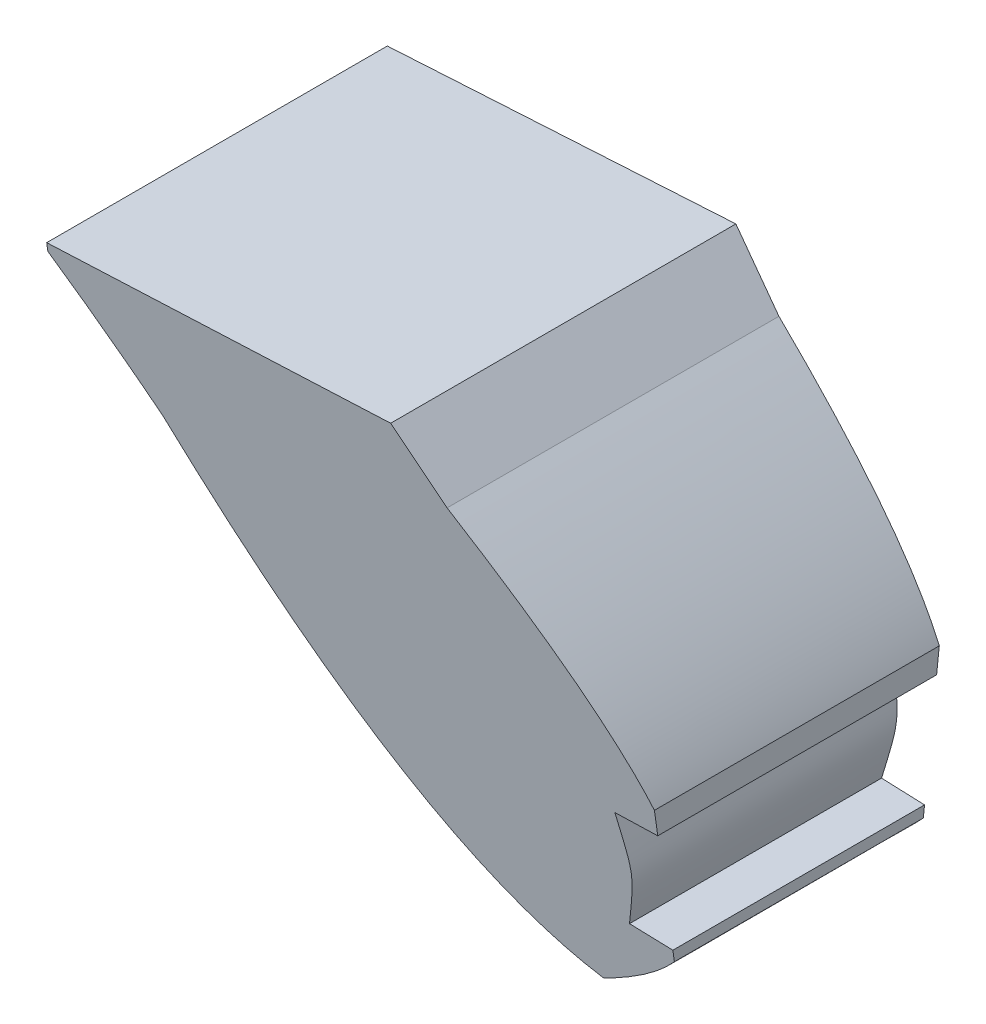
ISO-10303-21;
HEADER;
FILE_DESCRIPTION(('STEP AP214'),'2;1');
FILE_NAME('part.step','',(''),(''),'','','');
FILE_SCHEMA(('AUTOMOTIVE_DESIGN { 1 0 10303 214 1 1 1 1 }'));
ENDSEC;
DATA;
#1=APPLICATION_CONTEXT('core data for automotive mechanical design processes');
#2=APPLICATION_PROTOCOL_DEFINITION('international standard','automotive_design',2000,#1);
#3=PRODUCT_CONTEXT('',#1,'mechanical');
#4=PRODUCT('Part','Part','',(#3));
#5=PRODUCT_RELATED_PRODUCT_CATEGORY('part','',(#4));
#6=PRODUCT_DEFINITION_FORMATION('','',#4);
#7=PRODUCT_DEFINITION_CONTEXT('part definition',#1,'design');
#8=PRODUCT_DEFINITION('design','',#6,#7);
#9=PRODUCT_DEFINITION_SHAPE('','',#8);
#10=(LENGTH_UNIT() NAMED_UNIT(*) SI_UNIT(.MILLI.,.METRE.));
#11=(NAMED_UNIT(*) PLANE_ANGLE_UNIT() SI_UNIT($,.RADIAN.));
#12=(NAMED_UNIT(*) SI_UNIT($,.STERADIAN.) SOLID_ANGLE_UNIT());
#13=UNCERTAINTY_MEASURE_WITH_UNIT(LENGTH_MEASURE(1.E-05),#10,'distance_accuracy_value','');
#14=(GEOMETRIC_REPRESENTATION_CONTEXT(3) GLOBAL_UNCERTAINTY_ASSIGNED_CONTEXT((#13)) GLOBAL_UNIT_ASSIGNED_CONTEXT((#10,
#11,#12)) REPRESENTATION_CONTEXT('',''));
#15=CARTESIAN_POINT('',(0.,0.,0.));
#16=DIRECTION('',(0.,0.,1.));
#17=DIRECTION('',(1.,0.,0.));
#18=AXIS2_PLACEMENT_3D('',#15,#16,#17);
#19=CARTESIAN_POINT('',(0.355125000055651,-1.23774703808888E-13,7.));
#20=DIRECTION('',(-1.,3.48538412642003E-13,0.));
#21=DIRECTION('',(-3.48538412642003E-13,-1.,0.));
#22=AXIS2_PLACEMENT_3D('',#19,#20,#21);
#23=PLANE('',#22);
#24=DIRECTION('',(0.,-0.993653373689782,0.112485434412263));
#25=VECTOR('',#24,1.);
#26=CARTESIAN_POINT('',(0.355125000056697,12.6081551722012,-7.));
#27=LINE('',#26,#25);
#28=CARTESIAN_POINT('',(0.355125000056697,3.0015495286345,-5.91249480185305));
#29=VERTEX_POINT('',#28);
#30=CARTESIAN_POINT('',(0.355125000056447,2.03738091179555,-5.80334715682562));
#31=VERTEX_POINT('',#30);
#32=EDGE_CURVE('E58',#29,#31,#27,.T.);
#33=ORIENTED_EDGE('',*,*,#32,.F.);
#34=DIRECTION('',(0.,0.,-1.));
#35=VECTOR('',#34,1.);
#36=CARTESIAN_POINT('',(0.355125000056697,3.0015495286345,7.));
#37=LINE('',#36,#35);
#38=CARTESIAN_POINT('',(0.355125000056697,3.0015495286345,5.64061850231631));
#39=VERTEX_POINT('',#38);
#40=EDGE_CURVE('E178',#39,#29,#37,.T.);
#41=ORIENTED_EDGE('',*,*,#40,.F.);
#42=DIRECTION('',(0.,0.99013607461042,0.140109078060878));
#43=VECTOR('',#42,1.);
#44=CARTESIAN_POINT('',(0.355125000056697,12.6081551722012,7.));
#45=LINE('',#44,#43);
#46=CARTESIAN_POINT('',(0.355125000056697,2.03738091179556,5.50418394603202));
#47=VERTEX_POINT('',#46);
#48=EDGE_CURVE('E153',#47,#39,#45,.T.);
#49=ORIENTED_EDGE('',*,*,#48,.F.);
#50=DIRECTION('',(0.,0.,-1.));
#51=VECTOR('',#50,1.);
#52=CARTESIAN_POINT('',(0.355125000056447,2.03738091179555,7.));
#53=LINE('',#52,#51);
#54=EDGE_CURVE('E171',#47,#31,#53,.T.);
#55=ORIENTED_EDGE('',*,*,#54,.T.);
#56=EDGE_LOOP('',(#33,#41,#49,#55));
#57=FACE_BOUND('',#56,.T.);
#58=ADVANCED_FACE('F43',(#57),#23,.F.);
#59=CARTESIAN_POINT('',(-23.0359211456035,0.,7.));
#60=DIRECTION('',(-1.,0.,0.));
#61=DIRECTION('',(0.,0.,1.));
#62=AXIS2_PLACEMENT_3D('',#59,#60,#61);
#63=PLANE('',#62);
#64=DIRECTION('',(0.,0.,-1.));
#65=VECTOR('',#64,1.);
#66=CARTESIAN_POINT('',(-23.0359211456035,11.8716122879342,7.));
#67=LINE('',#66,#65);
#68=CARTESIAN_POINT('',(-23.0359211456035,11.8716122879342,6.89577559376618));
#69=VERTEX_POINT('',#68);
#70=CARTESIAN_POINT('',(-23.0359211456035,11.8716122879342,-6.91662047501294));
#71=VERTEX_POINT('',#70);
#72=EDGE_CURVE('E189',#69,#71,#67,.T.);
#73=ORIENTED_EDGE('',*,*,#72,.T.);
#74=DIRECTION('',(0.,-0.993653373689782,0.112485434412263));
#75=VECTOR('',#74,1.);
#76=CARTESIAN_POINT('',(-23.0359211456035,12.6081551722012,-7.));
#77=LINE('',#76,#75);
#78=CARTESIAN_POINT('',(-23.0359211456035,11.5401378200983,-6.87909627341673));
#79=VERTEX_POINT('',#78);
#80=EDGE_CURVE('E321',#71,#79,#77,.T.);
#81=ORIENTED_EDGE('',*,*,#80,.T.);
#82=DIRECTION('',(0.,0.,-1.));
#83=VECTOR('',#82,1.);
#84=CARTESIAN_POINT('',(-23.0359211456035,11.5401378200983,7.));
#85=LINE('',#84,#83);
#86=CARTESIAN_POINT('',(-23.0359211456035,11.5401378200983,6.84887034177091));
#87=VERTEX_POINT('',#86);
#88=EDGE_CURVE('E194',#87,#79,#85,.T.);
#89=ORIENTED_EDGE('',*,*,#88,.F.);
#90=DIRECTION('',(0.,0.99013607461042,0.140109078060878));
#91=VECTOR('',#90,1.);
#92=CARTESIAN_POINT('',(-23.0359211456035,12.6081551722012,7.));
#93=LINE('',#92,#91);
#94=EDGE_CURVE('E317',#87,#69,#93,.T.);
#95=ORIENTED_EDGE('',*,*,#94,.T.);
#96=EDGE_LOOP('',(#73,#81,#89,#95));
#97=FACE_BOUND('',#96,.T.);
#98=ADVANCED_FACE('F318',(#97),#63,.T.);
#99=CARTESIAN_POINT('',(-18.9451921135982,7.54091889574655,7.));
#100=CARTESIAN_POINT('',(-10.2150083842792,-3.69764410322756,7.));
#101=CARTESIAN_POINT('',(-2.84660482498738,-5.05908110388432,7.));
#102=(BOUNDED_CURVE() B_SPLINE_CURVE(2,(#99,#100,#101),.UNSPECIFIED.,.F.,
.F.) B_SPLINE_CURVE_WITH_KNOTS((3,3),(0.497667241108509,0.499554279588011),
.UNSPECIFIED.) CURVE() GEOMETRIC_REPRESENTATION_ITEM() RATIONAL_B_SPLINE_CURVE((1.,1.,1.)) REPRESENTATION_ITEM(''));
#103=DIRECTION('',(0.,0.,-1.));
#104=VECTOR('',#103,1.);
#105=SURFACE_OF_LINEAR_EXTRUSION('',#102,#104);
#106=DIRECTION('',(0.,0.,-1.));
#107=VECTOR('',#106,1.);
#108=CARTESIAN_POINT('',(-18.9451921135982,7.54091889574657,7.));
#109=LINE('',#108,#107);
#110=CARTESIAN_POINT('',(-18.9451921135982,7.54091889574657,6.28296138155552));
#111=VERTEX_POINT('',#110);
#112=CARTESIAN_POINT('',(-18.9451921135982,7.54091889574657,-6.42636910524441));
#113=VERTEX_POINT('',#112);
#114=EDGE_CURVE('E198',#111,#113,#109,.T.);
#115=ORIENTED_EDGE('',*,*,#114,.T.);
#116=CARTESIAN_POINT('',(-18.9451921135982,7.54091889574655,-6.42636910524441));
#117=CARTESIAN_POINT('',(-18.7033608655423,7.22962108931645,-6.39112898035273));
#118=CARTESIAN_POINT('',(-18.4592647140916,6.9200497206851,-6.35608429494821));
#119=CARTESIAN_POINT('',(-17.9661198805234,6.30464603742845,-6.28641819962467));
#120=CARTESIAN_POINT('',(-17.7170694462669,5.99881510969872,-6.25179694670763));
#121=CARTESIAN_POINT('',(-17.2137366178937,5.3913665824337,-6.18303140604553));
#122=CARTESIAN_POINT('',(-16.9594535947769,5.08974949683998,-6.14888717648066));
#123=CARTESIAN_POINT('',(-16.4451285665965,4.49103725761873,-6.08111061767257));
#124=CARTESIAN_POINT('',(-16.1850826962375,4.19394537928884,-6.04747865920581));
#125=CARTESIAN_POINT('',(-15.6590118901181,3.60508061675355,-5.9808168731366));
#126=CARTESIAN_POINT('',(-15.3929875534481,3.31330720485499,-5.94778698579723));
#127=CARTESIAN_POINT('',(-14.8544901847056,2.7357195544677,-5.88240181277285));
#128=CARTESIAN_POINT('',(-14.5820174931064,2.44990500284308,-5.85004649163963));
#129=CARTESIAN_POINT('',(-13.9777704357619,1.83142011947111,-5.78003159245484));
#130=CARTESIAN_POINT('',(-13.6445482479649,1.50014167377654,-5.74252958132897));
#131=CARTESIAN_POINT('',(-12.9673134934436,0.848664446736887,-5.66877982026175));
#132=CARTESIAN_POINT('',(-12.623301443116,0.528465136688492,-5.63253201046914));
#133=CARTESIAN_POINT('',(-11.9227759490938,-0.0995013958587513,-5.5614437516454));
#134=CARTESIAN_POINT('',(-11.5662405708663,-0.407244542107335,-5.52660602813964));
#135=CARTESIAN_POINT('',(-10.840142749037,-1.00720368374379,-5.45868831511867));
#136=CARTESIAN_POINT('',(-10.4705807273197,-1.29942018121482,-5.4256082687657));
#137=CARTESIAN_POINT('',(-9.71382699072171,-1.86779135556405,-5.36126643674768));
#138=CARTESIAN_POINT('',(-9.32650636654571,-2.14377746328672,-5.330023733768));
#139=CARTESIAN_POINT('',(-8.5360986768139,-2.67282289543975,-5.27013372902864));
#140=CARTESIAN_POINT('',(-8.13300835344273,-2.92587744631612,-5.24148696765387));
#141=CARTESIAN_POINT('',(-7.31201826568453,-3.40280761684766,-5.18749661363601));
#142=CARTESIAN_POINT('',(-6.89419365451789,-3.62680992502778,-5.16213867935817));
#143=CARTESIAN_POINT('',(-6.04187322097519,-4.0405536088069,-5.11530128189388));
#144=CARTESIAN_POINT('',(-5.60738935372736,-4.23031901573022,-5.09381909826786));
#145=CARTESIAN_POINT('',(-4.78985442909107,-4.54236533838515,-5.05849423842238));
#146=CARTESIAN_POINT('',(-4.4091055725695,-4.67052923075731,-5.04398558631979));
#147=CARTESIAN_POINT('',(-3.82960691198316,-4.83674345690554,-5.02516948814227));
#148=CARTESIAN_POINT('',(-3.63462104960687,-4.8878904691115,-5.01937944702812));
#149=CARTESIAN_POINT('',(-3.24229120544362,-4.9807402777546,-5.00886848683127));
#150=CARTESIAN_POINT('',(-3.0449461414238,-5.02243854990591,-5.00414807991536));
#151=CARTESIAN_POINT('',(-2.84660482498738,-5.05908110388432,-5.));
#152=B_SPLINE_CURVE_WITH_KNOTS('',3,(#116,#117,#118,#119,#120,#121,#122,#123,#124,#125,#126,
#127,#128,#129,#130,#131,#132,#133,#134,#135,#136,#137,#138,#139,#140,#141,#142,#143,#144,#145,
#146,#147,#148,#149,#150,#151),.UNSPECIFIED.,.F.,.F.,(4,2,2,2,2,2,2,2,2,2,2,2,2,2,2,2,2,4),(0.,
1.1872997216569,2.37502708567824,3.56289806807204,4.75159146291787,5.94016626761519,
7.12867845491362,8.54255640265696,9.95636678593971,11.3727907462706,12.7891688759803,
14.2183172044781,15.6477623519031,17.0707480146133,18.4927309460623,19.6971402338765,
20.3019233237111,20.9069953892921),.UNSPECIFIED.);
#153=CARTESIAN_POINT('',(-2.84660482498738,-5.05908110388432,-5.));
#154=VERTEX_POINT('',#153);
#155=EDGE_CURVE('E258',#113,#154,#152,.T.);
#156=ORIENTED_EDGE('',*,*,#155,.T.);
#157=DIRECTION('',(0.,0.,-1.));
#158=VECTOR('',#157,1.);
#159=CARTESIAN_POINT('',(-2.84660482498738,-5.05908110388432,7.));
#160=LINE('',#159,#158);
#161=CARTESIAN_POINT('',(-2.84660482498738,-5.05908110388432,4.5));
#162=VERTEX_POINT('',#161);
#163=EDGE_CURVE('E158',#162,#154,#160,.T.);
#164=ORIENTED_EDGE('',*,*,#163,.F.);
#165=CARTESIAN_POINT('',(-2.84660482498738,-5.05908110388432,4.5));
#166=CARTESIAN_POINT('',(-3.08316823365113,-5.01538391928878,4.50618336449356));
#167=CARTESIAN_POINT('',(-3.31831142936302,-4.96448471535211,4.51338584980893));
#168=CARTESIAN_POINT('',(-3.7843919930757,-4.84960818050363,4.52964143911748));
#169=CARTESIAN_POINT('',(-4.01534180088344,-4.78568046879588,4.53868752175156));
#170=CARTESIAN_POINT('',(-4.47304732324807,-4.64585129480142,4.55847403105746));
#171=CARTESIAN_POINT('',(-4.69980965005556,-4.56997090987282,4.56921147518041));
#172=CARTESIAN_POINT('',(-5.14917926219096,-4.40727123841656,4.59223427129206));
#173=CARTESIAN_POINT('',(-5.37178816220084,-4.32045630900045,4.60451900672825));
#174=CARTESIAN_POINT('',(-5.80917587742685,-4.13838850351906,4.6302824881574));
#175=CARTESIAN_POINT('',(-6.02402318281317,-4.04329632548979,4.64373849459543));
#176=CARTESIAN_POINT('',(-6.44971205639908,-3.84433630090396,4.67189230731926));
#177=CARTESIAN_POINT('',(-6.66055058827612,-3.74046210349849,4.68659101228112));
#178=CARTESIAN_POINT('',(-7.07819571598386,-3.52476747218135,4.71711285338101));
#179=CARTESIAN_POINT('',(-7.28499975417029,-3.41294219379375,4.73293667503598));
#180=CARTESIAN_POINT('',(-7.69452575700284,-3.18214540611944,4.76559554483141));
#181=CARTESIAN_POINT('',(-7.89724710579994,-3.06317282932808,4.78243074402897));
#182=CARTESIAN_POINT('',(-8.44144422527808,-2.73186457259704,4.82931247634318));
#183=CARTESIAN_POINT('',(-8.77906761811889,-2.51330448944996,4.86023979283623));
#184=CARTESIAN_POINT('',(-9.44318361518711,-2.0602625561746,4.92434743341393));
#185=CARTESIAN_POINT('',(-9.76967557156503,-1.82577978171379,4.95752788829614));
#186=CARTESIAN_POINT('',(-10.4123932178419,-1.34318786263996,5.02581699581872));
#187=CARTESIAN_POINT('',(-10.7286147817019,-1.09507334675361,5.06092640852044));
#188=CARTESIAN_POINT('',(-11.3514084758682,-0.58726154138854,5.13278425281334));
#189=CARTESIAN_POINT('',(-11.6579803013836,-0.32756388667671,5.16953273608677));
#190=CARTESIAN_POINT('',(-12.2657717603932,0.204937874877057,5.24488432945887));
#191=CARTESIAN_POINT('',(-12.5668849325,0.477860819352892,5.28350425566166));
#192=CARTESIAN_POINT('',(-13.1605559876794,1.0324381596372,5.36197965096655));
#193=CARTESIAN_POINT('',(-13.4531171177529,1.3140891556955,5.40183463898745));
#194=CARTESIAN_POINT('',(-14.0304209817893,1.88506143732125,5.48262999836104));
#195=CARTESIAN_POINT('',(-14.315164604997,2.17438184306939,5.52357024521501));
#196=CARTESIAN_POINT('',(-14.8774355268443,2.759761212625,5.6064042777156));
#197=CARTESIAN_POINT('',(-15.1549634033539,3.05581963323813,5.64829798649757));
#198=CARTESIAN_POINT('',(-15.7395273464491,3.69335187590619,5.73851190460923));
#199=CARTESIAN_POINT('',(-16.0456279760032,4.03566584468447,5.7869509987931));
#200=CARTESIAN_POINT('',(-16.6500045091362,4.72700005591174,5.88477815755521));
#201=CARTESIAN_POINT('',(-16.9482802857057,5.0760204070565,5.93416623751443));
#202=CARTESIAN_POINT('',(-17.4365247352486,5.6592188758257,6.01669166192937));
#203=CARTESIAN_POINT('',(-17.6285448905554,5.89171821333679,6.04959145082077));
#204=CARTESIAN_POINT('',(-18.0096325929718,6.35907701745418,6.11572499836805));
#205=CARTESIAN_POINT('',(-18.198700140463,6.5939364837553,6.14895875698074));
#206=CARTESIAN_POINT('',(-18.5740193448247,7.06583391900482,6.21573454294341));
#207=CARTESIAN_POINT('',(-18.7602711314597,7.30287178674687,6.2492765559722));
#208=CARTESIAN_POINT('',(-18.9451921135982,7.54091889574655,6.28296138155552));
#209=B_SPLINE_CURVE_WITH_KNOTS('',3,(#165,#166,#167,#168,#169,#170,#171,#172,#173,#174,#175,
#176,#177,#178,#179,#180,#181,#182,#183,#184,#185,#186,#187,#188,#189,#190,#191,#192,#193,#194,
#195,#196,#197,#198,#199,#200,#201,#202,#203,#204,#205,#206,#207,#208),.UNSPECIFIED.,.F.,.F.,(4,
2,2,2,2,2,2,2,2,2,2,2,2,2,2,2,2,2,2,2,2,4),(0.,0.721730177747976,1.44076134999608,
2.15853849069044,2.87603051670914,3.58182146015315,4.28812724572552,4.99486712283183,
5.70171282074783,6.91125282240967,8.12086309953551,9.33095346242866,10.5410820082308,
11.765549458026,12.9895458045438,14.2134023391781,15.4371605579857,16.8223113577724,
18.20748462679,19.1174570807307,20.0274294170124,20.9373596884893),.UNSPECIFIED.);
#210=EDGE_CURVE('E140',#162,#111,#209,.T.);
#211=ORIENTED_EDGE('',*,*,#210,.T.);
#212=EDGE_LOOP('',(#115,#156,#164,#211));
#213=FACE_BOUND('',#212,.T.);
#214=ADVANCED_FACE('F44',(#213),#105,.F.);
#215=CARTESIAN_POINT('',(-2.84660482498738,-5.05908110388432,7.));
#216=CARTESIAN_POINT('',(-0.742366881974002,-3.93520659958673,7.));
#217=CARTESIAN_POINT('',(0.355124999965198,-2.72325322699678,7.));
#218=(BOUNDED_CURVE() B_SPLINE_CURVE(2,(#215,#216,#217),.UNSPECIFIED.,.F.,
.F.) B_SPLINE_CURVE_WITH_KNOTS((3,3),(0.498812074629495,0.499412845463797),
.UNSPECIFIED.) CURVE() GEOMETRIC_REPRESENTATION_ITEM() RATIONAL_B_SPLINE_CURVE((1.,1.,1.)) REPRESENTATION_ITEM(''));
#219=DIRECTION('',(0.,0.,-1.));
#220=VECTOR('',#219,1.);
#221=SURFACE_OF_LINEAR_EXTRUSION('',#218,#220);
#222=ORIENTED_EDGE('',*,*,#163,.T.);
#223=CARTESIAN_POINT('',(-2.84660482498738,-5.05908110388432,-5.));
#224=CARTESIAN_POINT('',(-2.67154367534484,-4.96554243060771,-5.01058894235803));
#225=CARTESIAN_POINT('',(-2.49778385523126,-4.86952307483158,-5.02145870764284));
#226=CARTESIAN_POINT('',(-2.15332890723938,-4.67164155861341,-5.04385966647148));
#227=CARTESIAN_POINT('',(-1.9826387176766,-4.56977092703724,-5.05539181898071));
#228=CARTESIAN_POINT('',(-1.64527137465746,-4.35955519460265,-5.0791890591545));
#229=CARTESIAN_POINT('',(-1.47859514121983,-4.25120862887406,-5.09145431264808));
#230=CARTESIAN_POINT('',(-1.15044448784201,-4.02724001195876,-5.11680843294344));
#231=CARTESIAN_POINT('',(-0.98896568487432,-3.911624347545,-5.12989657673763));
#232=CARTESIAN_POINT('',(-0.724614348138144,-3.7114805449727,-5.15255363519824));
#233=CARTESIAN_POINT('',(-0.619967455079453,-3.6292658395869,-5.16186066025876));
#234=CARTESIAN_POINT('',(-0.414118763296717,-3.46070156785231,-5.18094279275538));
#235=CARTESIAN_POINT('',(-0.312916415666604,-3.3743526656372,-5.19071782500895));
#236=CARTESIAN_POINT('',(-0.114288127047668,-3.19685300163986,-5.21081147873311));
#237=CARTESIAN_POINT('',(-0.0168745915935635,-3.10568844995875,-5.221131661274));
#238=CARTESIAN_POINT('',(0.173044677325634,-2.91833195578561,-5.24234114658855));
#239=CARTESIAN_POINT('',(0.265547074526193,-2.82213668167119,-5.25323082651485));
#240=CARTESIAN_POINT('',(0.355124999965198,-2.72325322699678,-5.26442481895704));
#241=B_SPLINE_CURVE_WITH_KNOTS('',3,(#223,#224,#225,#226,#227,#228,#229,#230,#231,#232,#233,
#234,#235,#236,#237,#238,#239,#240),.UNSPECIFIED.,.F.,.F.,(4,2,2,2,2,2,2,2,4),(0.,
0.596333361221147,1.19355295493407,1.79090815604603,2.38774565156578,2.78786762990545,
3.18792554534165,3.58919872466333,3.99074110013676),.UNSPECIFIED.);
#242=CARTESIAN_POINT('',(0.355125000010947,-2.72325322699678,-5.26442481895704));
#243=VERTEX_POINT('',#242);
#244=EDGE_CURVE('E160',#154,#243,#241,.T.);
#245=ORIENTED_EDGE('',*,*,#244,.T.);
#246=DIRECTION('',(0.,0.,-1.));
#247=VECTOR('',#246,1.);
#248=CARTESIAN_POINT('',(0.355124999965198,-2.72325322699678,7.));
#249=LINE('',#248,#247);
#250=CARTESIAN_POINT('',(0.355125000010947,-2.72325322699678,4.83053102369629));
#251=VERTEX_POINT('',#250);
#252=EDGE_CURVE('E149',#251,#243,#249,.T.);
#253=ORIENTED_EDGE('',*,*,#252,.F.);
#254=CARTESIAN_POINT('',(0.355124999965198,-2.72325322699678,4.83053102369629));
#255=CARTESIAN_POINT('',(0.288398149772846,-2.79692983523062,4.82010542471147));
#256=CARTESIAN_POINT('',(0.220027994435931,-2.86911533915015,4.80989082425112));
#257=CARTESIAN_POINT('',(0.0804061460877187,-3.01065537637224,4.78986221946395));
#258=CARTESIAN_POINT('',(0.00915546128611754,-3.08001088340932,4.78004807734896));
#259=CARTESIAN_POINT('',(-0.208051484679109,-3.28382442773488,4.75120746793776));
#260=CARTESIAN_POINT('',(-0.357769759654032,-3.41436310844518,4.73273560869073));
#261=CARTESIAN_POINT('',(-0.664619715222997,-3.66601865094283,4.6971251234732));
#262=CARTESIAN_POINT('',(-0.821740259113732,-3.78714898341018,4.67998459133586));
#263=CARTESIAN_POINT('',(-1.14213102730476,-4.02152010188712,4.64681993631931));
#264=CARTESIAN_POINT('',(-1.30540814621445,-4.13475161200024,4.63079712602464));
#265=CARTESIAN_POINT('',(-1.58224551571986,-4.3181024050907,4.60485209559865));
#266=CARTESIAN_POINT('',(-1.69450828710985,-4.39015962319822,4.59465564820565));
#267=CARTESIAN_POINT('',(-1.92089392297144,-4.53136879893755,4.5746738619301));
#268=CARTESIAN_POINT('',(-2.03501691909358,-4.60052054969575,4.56488855232118));
#269=CARTESIAN_POINT('',(-2.26459491053106,-4.73598968280433,4.54571901004083));
#270=CARTESIAN_POINT('',(-2.38004610472666,-4.80231339855723,4.53633388116208));
#271=CARTESIAN_POINT('',(-2.61233128290528,-4.93249301426238,4.51791283136249));
#272=CARTESIAN_POINT('',(-2.72916500067534,-4.9963493795327,4.50887684459687));
#273=CARTESIAN_POINT('',(-2.84660482498738,-5.05908110388432,4.5));
#274=B_SPLINE_CURVE_WITH_KNOTS('',3,(#254,#255,#256,#257,#258,#259,#260,#261,#262,#263,#264,
#265,#266,#267,#268,#269,#270,#271,#272,#273),.UNSPECIFIED.,.F.,.F.,(4,2,2,2,2,2,2,2,2,4),(0.,
0.299777970085641,0.599451908644777,1.19743570496462,1.79454690260993,2.39234790105661,
2.7936688162816,3.19501825790138,3.59541580193974,3.99573746266343),.UNSPECIFIED.);
#275=EDGE_CURVE('E131',#251,#162,#274,.T.);
#276=ORIENTED_EDGE('',*,*,#275,.T.);
#277=EDGE_LOOP('',(#222,#245,#253,#276));
#278=FACE_BOUND('',#277,.T.);
#279=ADVANCED_FACE('F156',(#278),#221,.F.);
#280=CARTESIAN_POINT('',(0.355125000532009,-7.39148800447813E-11,7.));
#281=DIRECTION('',(1.,-2.08137641489758E-10,0.));
#282=DIRECTION('',(2.08137641489758E-10,1.,0.));
#283=AXIS2_PLACEMENT_3D('',#280,#281,#282);
#284=PLANE('',#283);
#285=CARTESIAN_POINT('',(0.355125000056697,-2.28484178142546,-5.31405470319249));
#286=VERTEX_POINT('',#285);
#287=EDGE_CURVE('E155',#286,#243,#27,.T.);
#288=ORIENTED_EDGE('',*,*,#287,.F.);
#289=DIRECTION('',(0.,0.,-1.));
#290=VECTOR('',#289,1.);
#291=CARTESIAN_POINT('',(0.355125000056447,-2.28484178142545,7.));
#292=LINE('',#291,#290);
#293=CARTESIAN_POINT('',(0.355125000056697,-2.28484178142546,4.89256837899062));
#294=VERTEX_POINT('',#293);
#295=EDGE_CURVE('E151',#294,#286,#292,.T.);
#296=ORIENTED_EDGE('',*,*,#295,.F.);
#297=EDGE_CURVE('E133',#251,#294,#45,.T.);
#298=ORIENTED_EDGE('',*,*,#297,.F.);
#299=ORIENTED_EDGE('',*,*,#252,.T.);
#300=EDGE_LOOP('',(#288,#296,#298,#299));
#301=FACE_BOUND('',#300,.T.);
#302=ADVANCED_FACE('F146',(#301),#284,.T.);
#303=CARTESIAN_POINT('',(-0.0792587195419091,-2.26967276768239,7.));
#304=DIRECTION('',(-0.0348994967024901,-0.999390827019096,0.));
#305=DIRECTION('',(0.999390827019096,-0.0348994967024901,0.));
#306=AXIS2_PLACEMENT_3D('',#303,#304,#305);
#307=PLANE('',#306);
#308=ORIENTED_EDGE('',*,*,#295,.T.);
#309=DIRECTION('',(-0.999383027616045,0.034899224341334,-0.00395072820626436));
#310=VECTOR('',#309,1.);
#311=CARTESIAN_POINT('',(-0.0306324717090319,-2.27137083367421,-5.31557966697752));
#312=LINE('',#311,#310);
#313=CARTESIAN_POINT('',(-1.39487499994356,-2.22373043481491,-5.32097274579469));
#314=VERTEX_POINT('',#313);
#315=EDGE_CURVE('E305',#286,#314,#312,.T.);
#316=ORIENTED_EDGE('',*,*,#315,.T.);
#317=DIRECTION('',(0.,0.,-1.));
#318=VECTOR('',#317,1.);
#319=CARTESIAN_POINT('',(-1.39487499994356,-2.22373043481491,7.));
#320=LINE('',#319,#318);
#321=CARTESIAN_POINT('',(-1.39487499994356,-2.22373043481491,4.90121593224337));
#322=VERTEX_POINT('',#321);
#323=EDGE_CURVE('E161',#322,#314,#320,.T.);
#324=ORIENTED_EDGE('',*,*,#323,.F.);
#325=DIRECTION('',(0.999378640532074,-0.0348990711409859,-0.00493838857923487));
#326=VECTOR('',#325,1.);
#327=CARTESIAN_POINT('',(-0.0896489754942184,-2.26930993194932,4.89476621135577));
#328=LINE('',#327,#326);
#329=EDGE_CURVE('E322',#322,#294,#328,.T.);
#330=ORIENTED_EDGE('',*,*,#329,.T.);
#331=EDGE_LOOP('',(#308,#316,#324,#330));
#332=FACE_BOUND('',#331,.T.);
#333=ADVANCED_FACE('F333',(#332),#307,.F.);
#334=CARTESIAN_POINT('',(-1.39487499994356,-2.22373043481491,7.));
#335=CARTESIAN_POINT('',(-0.907530669798052,-0.123730434814926,7.));
#336=CARTESIAN_POINT('',(-1.39487499994356,1.976269565185,7.));
#337=(BOUNDED_CURVE() B_SPLINE_CURVE(2,(#334,#335,#336),.UNSPECIFIED.,.F.,
.F.) B_SPLINE_CURVE_WITH_KNOTS((3,3),(0.,1.),
.UNSPECIFIED.) CURVE() GEOMETRIC_REPRESENTATION_ITEM() RATIONAL_B_SPLINE_CURVE((1.,
3.23180121851367,1.)) REPRESENTATION_ITEM(''));
#338=DIRECTION('',(0.,0.,-1.));
#339=VECTOR('',#338,1.);
#340=SURFACE_OF_LINEAR_EXTRUSION('',#337,#339);
#341=ORIENTED_EDGE('',*,*,#323,.T.);
#342=CARTESIAN_POINT('',(-1.39487499994356,-2.22373043481491,-5.32097274579469));
#343=CARTESIAN_POINT('',(-1.38202447122813,-2.16835021356968,-5.32724200266994));
#344=CARTESIAN_POINT('',(-1.36921744547373,-2.11295996104296,-5.33351239512535));
#345=CARTESIAN_POINT('',(-1.34371955909939,-2.00215267308472,-5.34605621196536));
#346=CARTESIAN_POINT('',(-1.33102869927897,-1.94673563747162,-5.35232963637053));
#347=CARTESIAN_POINT('',(-1.30579250980865,-1.83586894873068,-5.36488017761064));
#348=CARTESIAN_POINT('',(-1.29324717983284,-1.78041929567618,-5.37115729443729));
#349=CARTESIAN_POINT('',(-1.26834035470031,-1.66945670178657,-5.383718692514));
#350=CARTESIAN_POINT('',(-1.25597893242913,-1.61394374477822,-5.39000297559494));
#351=CARTESIAN_POINT('',(-1.23150428056634,-1.50286329328951,-5.40257771561119));
#352=CARTESIAN_POINT('',(-1.21939105277074,-1.44729579841754,-5.40886817259083));
#353=CARTESIAN_POINT('',(-1.19550012207595,-1.33608743052918,-5.42145739324204));
#354=CARTESIAN_POINT('',(-1.1837224309966,-1.2804465549999,-5.42775615719808));
#355=CARTESIAN_POINT('',(-1.15485704104805,-1.14125615214793,-5.44351305326002));
#356=CARTESIAN_POINT('',(-1.13805530724695,-1.05764770999797,-5.45297785475397));
#357=CARTESIAN_POINT('',(-1.10616760722362,-0.890046794372653,-5.47195093158457));
#358=CARTESIAN_POINT('',(-1.09108267359643,-0.806054121054038,-5.48145922954426));
#359=CARTESIAN_POINT('',(-1.06839764881353,-0.664871544058104,-5.49744164748328));
#360=CARTESIAN_POINT('',(-1.05995626751594,-0.607817685780514,-5.50390036659317));
#361=CARTESIAN_POINT('',(-1.04516806244473,-0.493450404650503,-5.51684718853439));
#362=CARTESIAN_POINT('',(-1.03882061818002,-0.436137063802354,-5.52333528208253));
#363=CARTESIAN_POINT('',(-1.02903068414648,-0.321308074689071,-5.53633437116685));
#364=CARTESIAN_POINT('',(-1.02558541499307,-0.263792673078833,-5.54284533878074));
#365=CARTESIAN_POINT('',(-1.02222407231355,-0.148714957691158,-5.55587258464867));
#366=CARTESIAN_POINT('',(-1.02230420900467,-0.0911527608046732,-5.56238884967019));
#367=CARTESIAN_POINT('',(-1.02596900528622,0.0239015023985966,-5.57541344065945));
#368=CARTESIAN_POINT('',(-1.02955657044098,0.0813934710005595,-5.58192175556548));
#369=CARTESIAN_POINT('',(-1.03959132289802,0.196133385303809,-5.59491076103416));
#370=CARTESIAN_POINT('',(-1.04603929917214,0.253381259276288,-5.60139144347683));
#371=CARTESIAN_POINT('',(-1.05997220439613,0.35983137212623,-5.6134420111136));
#372=CARTESIAN_POINT('',(-1.06719667195452,0.409068491171902,-5.61901584487869));
#373=CARTESIAN_POINT('',(-1.08274764683563,0.507347946837772,-5.63014146227917));
#374=CARTESIAN_POINT('',(-1.0910737056158,0.556390354412903,-5.63569325394695));
#375=CARTESIAN_POINT('',(-1.10853037258208,0.654424381213792,-5.64679108784343));
#376=CARTESIAN_POINT('',(-1.11766242226862,0.703415744133191,-5.65233710105724));
#377=CARTESIAN_POINT('',(-1.1364977866421,0.801294033672847,-5.6634173048888));
#378=CARTESIAN_POINT('',(-1.14620115522269,0.850180949988233,-5.66895149433999));
#379=CARTESIAN_POINT('',(-1.16833495400599,0.959258362431623,-5.68129948252998));
#380=CARTESIAN_POINT('',(-1.1808737668477,1.01942705832357,-5.68811081339709));
#381=CARTESIAN_POINT('',(-1.20639174214038,1.13967062360228,-5.70172285360526));
#382=CARTESIAN_POINT('',(-1.21937089694786,1.19974549459873,-5.70852356312855));
#383=CARTESIAN_POINT('',(-1.24564626429316,1.31982703510014,-5.72211726150049));
#384=CARTESIAN_POINT('',(-1.2589424791072,1.37983370411223,-5.72891025029334));
#385=CARTESIAN_POINT('',(-1.28569888355067,1.49948275843749,-5.74245498954463));
#386=CARTESIAN_POINT('',(-1.29915785770072,1.55912541262012,-5.74920677044014));
#387=CARTESIAN_POINT('',(-1.32625009614692,1.67837055204035,-5.76270578495002));
#388=CARTESIAN_POINT('',(-1.33988335761136,1.73797303791406,-5.76945301863641));
#389=CARTESIAN_POINT('',(-1.36728618039678,1.85714403003134,-5.78294363938264));
#390=CARTESIAN_POINT('',(-1.381055735056,1.91671253778666,-5.7896870266136));
#391=CARTESIAN_POINT('',(-1.39487499994356,1.976269565185,-5.79642911422342));
#392=B_SPLINE_CURVE_WITH_KNOTS('',3,(#342,#343,#344,#345,#346,#347,#348,#349,#350,#351,#352,
#353,#354,#355,#356,#357,#358,#359,#360,#361,#362,#363,#364,#365,#366,#367,#368,#369,#370,#371,
#372,#373,#374,#375,#376,#377,#378,#379,#380,#381,#382,#383,#384,#385,#386,#387,#388,#389,#390,
#391),.UNSPECIFIED.,.F.,.F.,(4,2,2,2,2,2,2,2,2,2,2,2,2,2,2,2,2,2,2,2,2,2,2,2,4),(0.,
0.171588763273453,0.343178706622211,0.514768265617104,0.686424107910212,0.858081191922478,
1.02974431538338,1.28714724145325,1.54470417716685,1.71878537631805,1.8928149439917,
2.06667765516018,2.24035346989174,2.41417328020677,2.58804106414591,2.73825198714263,
2.88840193486919,3.03882608638502,3.18926445051695,3.37477476712053,3.56028186526787,
3.74579029559563,3.93033206952695,4.11487084894101,4.29940065253389),.UNSPECIFIED.);
#393=CARTESIAN_POINT('',(-1.39487499994356,1.976269565185,-5.79642911422342));
#394=VERTEX_POINT('',#393);
#395=EDGE_CURVE('E180',#314,#394,#392,.T.);
#396=ORIENTED_EDGE('',*,*,#395,.T.);
#397=DIRECTION('',(0.,0.,-1.));
#398=VECTOR('',#397,1.);
#399=CARTESIAN_POINT('',(-1.39487499994356,1.976269565185,7.));
#400=LINE('',#399,#398);
#401=CARTESIAN_POINT('',(-1.39487499994356,1.976269565185,5.49553639277927));
#402=VERTEX_POINT('',#401);
#403=EDGE_CURVE('E166',#402,#394,#400,.T.);
#404=ORIENTED_EDGE('',*,*,#403,.F.);
#405=CARTESIAN_POINT('',(-1.39487499994356,1.976269565185,5.49553639277927));
#406=CARTESIAN_POINT('',(-1.37914084398006,1.90845424769187,5.48594019498787));
#407=CARTESIAN_POINT('',(-1.36346939179812,1.84062449867633,5.47634195506574));
#408=CARTESIAN_POINT('',(-1.33230786545499,1.70491071481643,5.45713779351224));
#409=CARTESIAN_POINT('',(-1.31681782612787,1.63702667213594,5.44753187077202));
#410=CARTESIAN_POINT('',(-1.28607987500711,1.50119914282606,5.42831161368324));
#411=CARTESIAN_POINT('',(-1.27083198240421,1.43325565193105,5.41869727873106));
#412=CARTESIAN_POINT('',(-1.24053169618827,1.29664983132199,5.39936688963195));
#413=CARTESIAN_POINT('',(-1.22548253007976,1.22798679763941,5.38965073587004));
#414=CARTESIAN_POINT('',(-1.19588049253528,1.09055976032742,5.37020414060686));
#415=CARTESIAN_POINT('',(-1.1813275922826,1.02179576280338,5.36047369996953));
#416=CARTESIAN_POINT('',(-1.15295772410687,0.884120942116688,5.34099204215174));
#417=CARTESIAN_POINT('',(-1.13914072208027,0.815210125912216,5.3312408259559));
#418=CARTESIAN_POINT('',(-1.11598238231518,0.694534515279337,5.31416463917333));
#419=CARTESIAN_POINT('',(-1.10638952623419,0.642817356017971,5.3068464091948));
#420=CARTESIAN_POINT('',(-1.08811515834215,0.539226151717413,5.2921877491359));
#421=CARTESIAN_POINT('',(-1.07943360192222,0.487352114485538,5.28484732016031));
#422=CARTESIAN_POINT('',(-1.06339176817411,0.38354902297608,5.27015867702912));
#423=CARTESIAN_POINT('',(-1.05602785753811,0.331620529924687,5.26281054228978));
#424=CARTESIAN_POINT('',(-1.04311793353537,0.227537504303506,5.24808228711808));
#425=CARTESIAN_POINT('',(-1.03757187360073,0.17538297755871,5.24070216750999));
#426=CARTESIAN_POINT('',(-1.02864424193531,0.0676543661019038,5.22545804418286));
#427=CARTESIAN_POINT('',(-1.02541662985478,0.0120671002254514,5.21759217526486));
#428=CARTESIAN_POINT('',(-1.02225686415304,-0.0991954704662792,5.20184797949012));
#429=CARTESIAN_POINT('',(-1.02232414703968,-0.15487075859942,5.19396965499398));
#430=CARTESIAN_POINT('',(-1.02574159575764,-0.266177078058974,5.17821926855547));
#431=CARTESIAN_POINT('',(-1.02909535151219,-0.321807994408618,5.17034722288286));
#432=CARTESIAN_POINT('',(-1.03851841028781,-0.432846345683605,5.15463475524788));
#433=CARTESIAN_POINT('',(-1.04458839126886,-0.488253721328068,5.14679434167405));
#434=CARTESIAN_POINT('',(-1.05865862914702,-0.598405672440089,5.13120730398028));
#435=CARTESIAN_POINT('',(-1.06664436828839,-0.653152126070251,5.12346041409119));
#436=CARTESIAN_POINT('',(-1.08397142023363,-0.762425190249028,5.10799774318002));
#437=CARTESIAN_POINT('',(-1.0933126115065,-0.816951820057227,5.10028195943262));
#438=CARTESIAN_POINT('',(-1.11293260269779,-0.925862398787085,5.08487058197835));
#439=CARTESIAN_POINT('',(-1.12321181598419,-0.980246273833082,5.07717499872524));
#440=CARTESIAN_POINT('',(-1.14442109978651,-1.08888905207426,5.06180151634471));
#441=CARTESIAN_POINT('',(-1.15535117617682,-1.14314795413691,5.05412361737756));
#442=CARTESIAN_POINT('',(-1.17830717908582,-1.25464773727421,5.03834585488617));
#443=CARTESIAN_POINT('',(-1.19036009612797,-1.31188314590918,5.03024676573882));
#444=CARTESIAN_POINT('',(-1.21483526969217,-1.42627643908372,5.01405955748127));
#445=CARTESIAN_POINT('',(-1.22725752760172,-1.48343432333121,5.0059714384124));
#446=CARTESIAN_POINT('',(-1.25237335102566,-1.59769232794814,4.98980337414482));
#447=CARTESIAN_POINT('',(-1.26506692028936,-1.65479244750787,4.98172342906068));
#448=CARTESIAN_POINT('',(-1.29062444358815,-1.76879861546535,4.96559100090724));
#449=CARTESIAN_POINT('',(-1.30348786548222,-1.82570478099135,4.95753850126373));
#450=CARTESIAN_POINT('',(-1.32936968729609,-1.93948131968556,4.9414385667697));
#451=CARTESIAN_POINT('',(-1.34238808413615,-1.99635169354148,4.93339113182187));
#452=CARTESIAN_POINT('',(-1.36854744627539,-2.11006167371809,4.91730061568232));
#453=CARTESIAN_POINT('',(-1.38168840511251,-2.1669012814956,4.90925753428446));
#454=CARTESIAN_POINT('',(-1.39487499994356,-2.22373043481491,4.90121593224337));
#455=B_SPLINE_CURVE_WITH_KNOTS('',3,(#405,#406,#407,#408,#409,#410,#411,#412,#413,#414,#415,
#416,#417,#418,#419,#420,#421,#422,#423,#424,#425,#426,#427,#428,#429,#430,#431,#432,#433,#434,
#435,#436,#437,#438,#439,#440,#441,#442,#443,#444,#445,#446,#447,#448,#449,#450,#451,#452,#453,
#454),.UNSPECIFIED.,.F.,.F.,(4,2,2,2,2,2,2,2,2,2,2,2,2,2,2,2,2,2,2,2,2,2,2,2,4),(0.,
0.210825060002238,0.42168995900108,0.632571487009159,0.845453842487587,1.05832381538648,
1.27118391470552,1.43049638991068,1.58980106299504,1.7486594589587,1.90751378512662,
2.07613023202306,2.24471784227541,2.41348981187076,2.58230392985558,2.74987707079256,
2.917435196252,3.08506752121285,3.25270135937443,3.42984607216057,3.606991450505,
3.7841392784373,3.96082402688713,4.13750527001102,4.31417724971973),.UNSPECIFIED.);
#456=EDGE_CURVE('E66',#402,#322,#455,.T.);
#457=ORIENTED_EDGE('',*,*,#456,.T.);
#458=EDGE_LOOP('',(#341,#396,#404,#457));
#459=FACE_BOUND('',#458,.T.);
#460=ADVANCED_FACE('F179',(#459),#340,.F.);
#461=CARTESIAN_POINT('',(0.355125000056697,3.0015495286345,7.));
#462=CARTESIAN_POINT('',(-1.44872627004384,6.0584273141466,7.));
#463=CARTESIAN_POINT('',(-6.99487502582887,10.4773899922143,7.));
#464=(BOUNDED_CURVE() B_SPLINE_CURVE(2,(#461,#462,#463),.UNSPECIFIED.,.F.,
.F.) B_SPLINE_CURVE_WITH_KNOTS((3,3),(0.500820705122982,0.502013311782223),
.UNSPECIFIED.) CURVE() GEOMETRIC_REPRESENTATION_ITEM() RATIONAL_B_SPLINE_CURVE((1.,1.,1.)) REPRESENTATION_ITEM(''));
#465=DIRECTION('',(0.,0.,-1.));
#466=VECTOR('',#465,1.);
#467=SURFACE_OF_LINEAR_EXTRUSION('',#464,#466);
#468=ORIENTED_EDGE('',*,*,#40,.T.);
#469=CARTESIAN_POINT('',(0.355125000056697,3.0015495286345,-5.91249480185305));
#470=CARTESIAN_POINT('',(0.304611825062614,3.08713910892722,-5.92218387590574));
#471=CARTESIAN_POINT('',(0.252829574975965,3.17197675667728,-5.93178782826414));
#472=CARTESIAN_POINT('',(0.146996425684332,3.34022678950728,-5.95083438769209));
#473=CARTESIAN_POINT('',(0.092945870986308,3.42363938833331,-5.96027701895852));
#474=CARTESIAN_POINT('',(-0.0720259816016992,3.67159280703978,-5.9883463122913));
#475=CARTESIAN_POINT('',(-0.185954424573863,3.83416207979728,-6.00674978753972));
#476=CARTESIAN_POINT('',(-0.420195702371685,4.15456473361426,-6.04302061663943));
#477=CARTESIAN_POINT('',(-0.540506139916056,4.3123998585806,-6.06088816790776));
#478=CARTESIAN_POINT('',(-0.785880610008438,4.62328354155297,-6.09608141241009));
#479=CARTESIAN_POINT('',(-0.910922246407595,4.77634960365364,-6.11340908717582));
#480=CARTESIAN_POINT('',(-1.16542402575789,5.0789091469452,-6.14766000662507));
#481=CARTESIAN_POINT('',(-1.29488601263671,5.22840109188721,-6.16458307739923));
#482=CARTESIAN_POINT('',(-1.55752786665308,5.52415387167798,-6.19806344469258));
#483=CARTESIAN_POINT('',(-1.6907082385264,5.67041426299934,-6.21462069100275));
#484=CARTESIAN_POINT('',(-1.95676457683924,5.9562751983388,-6.24698126295326));
#485=CARTESIAN_POINT('',(-2.08955967948613,6.0959502005499,-6.26279301755123));
#486=CARTESIAN_POINT('',(-2.35774738083663,6.37276289931955,-6.29412929385883));
#487=CARTESIAN_POINT('',(-2.49313949667974,6.50990105841303,-6.30965386792921));
#488=CARTESIAN_POINT('',(-2.76622057988734,6.78188630008672,-6.34044365727978));
#489=CARTESIAN_POINT('',(-2.90390945120438,6.91673347799924,-6.35570888335196));
#490=CARTESIAN_POINT('',(-3.18157989443261,7.18458262668443,-6.38603045085686));
#491=CARTESIAN_POINT('',(-3.32156519397778,7.31758077815757,-6.40108635992999));
#492=CARTESIAN_POINT('',(-3.60336702010312,7.58165632334332,-6.4309807408121));
#493=CARTESIAN_POINT('',(-3.74518361420142,7.7127336458542,-6.44581920456076));
#494=CARTESIAN_POINT('',(-4.03045824598403,7.9731143136119,-6.47529531091817));
#495=CARTESIAN_POINT('',(-4.17391630095381,8.10241764014601,-6.48993295140857));
#496=CARTESIAN_POINT('',(-4.46327774044283,8.36024031964194,-6.51911948352564));
#497=CARTESIAN_POINT('',(-4.60919106044248,8.48874865574429,-6.53366712800089));
#498=CARTESIAN_POINT('',(-4.902378301708,8.74421850432193,-6.56258731048845));
#499=CARTESIAN_POINT('',(-5.04965220356223,8.87118003880593,-6.57695985099224));
#500=CARTESIAN_POINT('',(-5.34544402422969,9.12366570876955,-6.60554221283062));
#501=CARTESIAN_POINT('',(-5.4939619526495,9.24918983313146,-6.61975203290664));
#502=CARTESIAN_POINT('',(-5.79168814535511,9.49851914833085,-6.64797708308463));
#503=CARTESIAN_POINT('',(-5.94089298845833,9.62232837448879,-6.66199277000059));
#504=CARTESIAN_POINT('',(-6.24034209654586,9.86869525036086,-6.68988246050136));
#505=CARTESIAN_POINT('',(-6.39058634943962,9.99125291459239,-6.70375646572961));
#506=CARTESIAN_POINT('',(-6.69203115149199,10.2351870903959,-6.7313707651018));
#507=CARTESIAN_POINT('',(-6.84323165475483,10.356563657956,-6.74511106558381));
#508=CARTESIAN_POINT('',(-6.99487502582887,10.4773899922143,-6.75878907751167));
#509=B_SPLINE_CURVE_WITH_KNOTS('',3,(#469,#470,#471,#472,#473,#474,#475,#476,#477,#478,#479,
#480,#481,#482,#483,#484,#485,#486,#487,#488,#489,#490,#491,#492,#493,#494,#495,#496,#497,#498,
#499,#500,#501,#502,#503,#504,#505,#506,#507,#508),.UNSPECIFIED.,.F.,.F.,(4,2,2,2,2,2,2,2,2,2,2,
2,2,2,2,2,2,2,2,4),(0.,0.299537168074909,0.599029006346325,1.19691549709242,1.7945789713371,
2.38970027938851,2.98507294745423,3.58052682848059,4.16061190167034,4.74059014597745,
5.32054419682563,5.9015573265281,6.48259193915569,7.06363267602949,7.64855709920549,
8.23347319002028,8.81839380183376,9.40155465760286,9.98470874134178,10.5678350455167),.UNSPECIFIED.);
#510=CARTESIAN_POINT('',(-6.99487502582887,10.4773899922143,-6.75878907751168));
#511=VERTEX_POINT('',#510);
#512=EDGE_CURVE('E234',#29,#511,#509,.T.);
#513=ORIENTED_EDGE('',*,*,#512,.T.);
#514=DIRECTION('',(0.,0.,-1.));
#515=VECTOR('',#514,1.);
#516=CARTESIAN_POINT('',(-6.99487502582887,10.4773899922143,7.));
#517=LINE('',#516,#515);
#518=CARTESIAN_POINT('',(-6.99487502582887,10.4773899922143,6.69848634688959));
#519=VERTEX_POINT('',#518);
#520=EDGE_CURVE('E185',#519,#511,#517,.T.);
#521=ORIENTED_EDGE('',*,*,#520,.F.);
#522=CARTESIAN_POINT('',(-6.99487502582887,10.4773899922143,6.69848634688959));
#523=CARTESIAN_POINT('',(-6.84158546524746,10.3552519241052,6.68120321524969));
#524=CARTESIAN_POINT('',(-6.68875032844528,10.2325532219559,6.66384075116195));
#525=CARTESIAN_POINT('',(-6.38406167914067,9.98595127684514,6.62894537459355));
#526=CARTESIAN_POINT('',(-6.23220821721616,9.86204797263068,6.6114124534453));
#527=CARTESIAN_POINT('',(-5.92956943297327,9.61296441720839,6.57616591692851));
#528=CARTESIAN_POINT('',(-5.77878412444199,9.48778414956897,6.55845229923483));
#529=CARTESIAN_POINT('',(-5.47791551287613,9.23567294449489,6.52277733554295));
#530=CARTESIAN_POINT('',(-5.3278358014879,9.10873780307223,6.50481539465997));
#531=CARTESIAN_POINT('',(-5.02895769352054,8.85339901671363,6.46868371249299));
#532=CARTESIAN_POINT('',(-4.88015928568056,8.72499538470678,6.45051397303852));
#533=CARTESIAN_POINT('',(-4.5839653191639,8.46660666758059,6.41395071081));
#534=CARTESIAN_POINT('',(-4.43656977919637,8.33662156142266,6.39555718505889));
#535=CARTESIAN_POINT('',(-4.14583072032661,8.07718058151811,6.35884502252109));
#536=CARTESIAN_POINT('',(-4.00246097862861,7.9477535349853,6.34053046492559));
#537=CARTESIAN_POINT('',(-3.71738075817534,7.68712168768386,6.30364978884977));
#538=CARTESIAN_POINT('',(-3.57567026238934,7.55591690519206,6.2850836729557));
#539=CARTESIAN_POINT('',(-3.29410068758823,7.29158210042551,6.24767901035938));
#540=CARTESIAN_POINT('',(-3.15424154313352,7.15845214654961,6.22884047333589));
#541=CARTESIAN_POINT('',(-2.87684890997045,6.89033739517256,6.19090092987997));
#542=CARTESIAN_POINT('',(-2.73931161401725,6.75535646330957,6.17180047045417));
#543=CARTESIAN_POINT('',(-2.46656058802024,6.48309875810955,6.13327467884966));
#544=CARTESIAN_POINT('',(-2.3313469521149,6.34582189219979,6.11384933357145));
#545=CARTESIAN_POINT('',(-2.06354799876086,6.06872660684178,6.07463900080807));
#546=CARTESIAN_POINT('',(-1.93096315809442,5.92890773500958,6.05485394930837));
#547=CARTESIAN_POINT('',(-1.66671075187815,5.64419291363478,6.01456541507959));
#548=CARTESIAN_POINT('',(-1.53509319407029,5.4992513732327,5.9940554810218));
#549=CARTESIAN_POINT('',(-1.27554334514648,5.2061964203887,5.95258677756069));
#550=CARTESIAN_POINT('',(-1.14761055982423,5.05808343799402,5.93162806901113));
#551=CARTESIAN_POINT('',(-0.896120149597653,4.75835230875502,5.88921465406679));
#552=CARTESIAN_POINT('',(-0.772560736237726,4.6067356376414,5.86776015649508));
#553=CARTESIAN_POINT('',(-0.530097936195287,4.29884947651915,5.82419276481155));
#554=CARTESIAN_POINT('',(-0.411216496439858,4.14256299366659,5.80207746612954));
#555=CARTESIAN_POINT('',(-0.179743459438918,3.82536684482962,5.75719266583025));
#556=CARTESIAN_POINT('',(-0.067154186591464,3.66445550317728,5.73442292709781));
#557=CARTESIAN_POINT('',(0.0959066710392102,3.41909207973446,5.69970280737895));
#558=CARTESIAN_POINT('',(0.149335007063202,3.33656250738827,5.68802447084451));
#559=CARTESIAN_POINT('',(0.253965439932553,3.17011581842621,5.66447145350199));
#560=CARTESIAN_POINT('',(0.305167209245263,3.08619850015926,5.65259674415928));
#561=CARTESIAN_POINT('',(0.355125000056697,3.0015495286345,5.64061850231631));
#562=B_SPLINE_CURVE_WITH_KNOTS('',3,(#522,#523,#524,#525,#526,#527,#528,#529,#530,#531,#532,
#533,#534,#535,#536,#537,#538,#539,#540,#541,#542,#543,#544,#545,#546,#547,#548,#549,#550,#551,
#552,#553,#554,#555,#556,#557,#558,#559,#560,#561),.UNSPECIFIED.,.F.,.F.,(4,2,2,2,2,2,2,2,2,2,2,
2,2,2,2,2,2,2,2,4),(0.,0.590277066418877,1.18058430654731,1.77089915218651,2.3630318271678,
2.9551592928129,3.54729464424565,4.1293244401571,4.71134825678153,5.29335144541614,
5.87428325150538,6.45523853767315,7.03629824474943,7.62681032242492,8.21724282755233,
8.80743102274498,9.40011996770069,9.99302643078493,10.2900120065822,10.5870411228133),.UNSPECIFIED.);
#563=EDGE_CURVE('E225',#519,#39,#562,.T.);
#564=ORIENTED_EDGE('',*,*,#563,.T.);
#565=EDGE_LOOP('',(#468,#513,#521,#564));
#566=FACE_BOUND('',#565,.T.);
#567=ADVANCED_FACE('F211',(#566),#467,.F.);
#568=CARTESIAN_POINT('',(1.48452736456058,1.38434415860098,7.));
#569=DIRECTION('',(0.731353702758341,0.681998358840887,0.));
#570=DIRECTION('',(-0.681998358840887,0.731353702758341,0.));
#571=AXIS2_PLACEMENT_3D('',#568,#569,#570);
#572=PLANE('',#571);
#573=DIRECTION('',(0.679672917760627,-0.728859972498513,0.0825097894326689));
#574=VECTOR('',#573,1.);
#575=CARTESIAN_POINT('',(2.1983890766334,0.618821192725823,-5.64276066815224));
#576=LINE('',#575,#574);
#577=CARTESIAN_POINT('',(-8.98184569452943,12.6081551722012,-7.));
#578=VERTEX_POINT('',#577);
#579=EDGE_CURVE('E238',#578,#511,#576,.T.);
#580=ORIENTED_EDGE('',*,*,#579,.F.);
#581=DIRECTION('',(0.,0.,-1.));
#582=VECTOR('',#581,1.);
#583=CARTESIAN_POINT('',(-8.98184569452943,12.6081551722012,7.));
#584=LINE('',#583,#582);
#585=CARTESIAN_POINT('',(-8.98184569453097,12.6081551722012,6.99999999999999));
#586=VERTEX_POINT('',#585);
#587=EDGE_CURVE('E190',#586,#578,#584,.T.);
#588=ORIENTED_EDGE('',*,*,#587,.F.);
#589=DIRECTION('',(-0.678375265538954,0.727468410854836,0.102940324039185));
#590=VECTOR('',#589,1.);
#591=CARTESIAN_POINT('',(1.37361824122255,1.50327963252324,5.42860601311061));
#592=LINE('',#591,#590);
#593=EDGE_CURVE('E300',#519,#586,#592,.T.);
#594=ORIENTED_EDGE('',*,*,#593,.F.);
#595=ORIENTED_EDGE('',*,*,#520,.T.);
#596=EDGE_LOOP('',(#580,#588,#594,#595));
#597=FACE_BOUND('',#596,.T.);
#598=ADVANCED_FACE('F216',(#597),#572,.T.);
#599=CARTESIAN_POINT('',(-0.683557287645435,13.0430500394562,7.));
#600=DIRECTION('',(0.0523359562429403,-0.998629534754574,0.));
#601=DIRECTION('',(0.998629534754574,0.0523359562429404,0.));
#602=AXIS2_PLACEMENT_3D('',#599,#600,#601);
#603=PLANE('',#602);
#604=ORIENTED_EDGE('',*,*,#587,.T.);
#605=DIRECTION('',(-0.998612008623237,-0.0523350377373175,0.00592453023432517));
#606=VECTOR('',#605,1.);
#607=CARTESIAN_POINT('',(-0.766676856578225,13.0386939274334,-7.04873866500727));
#608=LINE('',#607,#606);
#609=EDGE_CURVE('E270',#578,#71,#608,.T.);
#610=ORIENTED_EDGE('',*,*,#609,.T.);
#611=ORIENTED_EDGE('',*,*,#72,.F.);
#612=DIRECTION('',(0.998602150579861,0.0523345210991561,0.00740558968608979));
#613=VECTOR('',#612,1.);
#614=CARTESIAN_POINT('',(-0.684012388673316,13.0430261886219,7.06153636732212));
#615=LINE('',#614,#613);
#616=EDGE_CURVE('E142',#69,#586,#615,.T.);
#617=ORIENTED_EDGE('',*,*,#616,.T.);
#618=EDGE_LOOP('',(#604,#610,#611,#617));
#619=FACE_BOUND('',#618,.T.);
#620=ADVANCED_FACE('F351',(#619),#603,.F.);
#621=CARTESIAN_POINT('',(-69.8841339427642,-40.4718315495759,7.));
#622=DIRECTION('',(0.,0.,-1.));
#623=DIRECTION('',(-1.,0.,0.));
#624=AXIS2_PLACEMENT_3D('',#621,#622,#623);
#625=CYLINDRICAL_SURFACE('',#624,69.9999999999998);
#626=CARTESIAN_POINT('',(-69.8841339427642,-40.4718315495759,-0.991138637385349));
#627=DIRECTION('',(0.,0.112485434412263,0.993653373689781));
#628=DIRECTION('',(0.,0.993653373689782,-0.112485434412263));
#629=AXIS2_PLACEMENT_3D('',#626,#627,#628);
#630=ELLIPSE('',#629,70.4471014273976,69.9999999999998);
#631=EDGE_CURVE('E301',#113,#79,#630,.T.);
#632=ORIENTED_EDGE('',*,*,#631,.F.);
#633=ORIENTED_EDGE('',*,*,#114,.F.);
#634=CARTESIAN_POINT('',(-69.8841339427642,-40.4718315495759,-0.511076703268311));
#635=DIRECTION('',(0.,0.140109078060878,-0.99013607461042));
#636=DIRECTION('',(0.,-0.99013607461042,-0.140109078060878));
#637=AXIS2_PLACEMENT_3D('',#634,#635,#636);
#638=ELLIPSE('',#637,70.6973534193693,69.9999999999998);
#639=EDGE_CURVE('E312',#87,#111,#638,.T.);
#640=ORIENTED_EDGE('',*,*,#639,.F.);
#641=ORIENTED_EDGE('',*,*,#88,.T.);
#642=EDGE_LOOP('',(#632,#633,#640,#641));
#643=FACE_BOUND('',#642,.T.);
#644=ADVANCED_FACE('F315',(#643),#625,.F.);
#645=CARTESIAN_POINT('',(-1.39487499994356,1.976269565185,7.));
#646=DIRECTION('',(-0.0348994967024943,0.999390827019096,0.));
#647=DIRECTION('',(-0.999390827019096,-0.0348994967024943,0.));
#648=AXIS2_PLACEMENT_3D('',#645,#646,#647);
#649=PLANE('',#648);
#650=ORIENTED_EDGE('',*,*,#403,.T.);
#651=DIRECTION('',(0.999383027616045,0.0348992243413382,-0.00395072820626483));
#652=VECTOR('',#651,1.);
#653=CARTESIAN_POINT('',(-1.44539902221403,1.9745052274495,-5.7962293843157));
#654=LINE('',#653,#652);
#655=EDGE_CURVE('E11',#394,#31,#654,.T.);
#656=ORIENTED_EDGE('',*,*,#655,.T.);
#657=ORIENTED_EDGE('',*,*,#54,.F.);
#658=DIRECTION('',(-0.999378640532074,-0.0348990711409901,-0.00493838857923546));
#659=VECTOR('',#658,1.);
#660=CARTESIAN_POINT('',(-1.38744999051618,1.97652885222769,5.49557308315894));
#661=LINE('',#660,#659);
#662=EDGE_CURVE('E52',#47,#402,#661,.T.);
#663=ORIENTED_EDGE('',*,*,#662,.T.);
#664=EDGE_LOOP('',(#650,#656,#657,#663));
#665=FACE_BOUND('',#664,.T.);
#666=ADVANCED_FACE('F169',(#665),#649,.F.);
#667=CARTESIAN_POINT('',(-23.0359211456035,12.6081551722012,7.));
#668=DIRECTION('',(0.,0.140109078060878,-0.99013607461042));
#669=DIRECTION('',(0.,0.99013607461042,0.140109078060878));
#670=AXIS2_PLACEMENT_3D('',#667,#668,#669);
#671=PLANE('',#670);
#672=ORIENTED_EDGE('',*,*,#593,.T.);
#673=ORIENTED_EDGE('',*,*,#616,.F.);
#674=ORIENTED_EDGE('',*,*,#94,.F.);
#675=ORIENTED_EDGE('',*,*,#639,.T.);
#676=ORIENTED_EDGE('',*,*,#210,.F.);
#677=ORIENTED_EDGE('',*,*,#275,.F.);
#678=ORIENTED_EDGE('',*,*,#297,.T.);
#679=ORIENTED_EDGE('',*,*,#329,.F.);
#680=ORIENTED_EDGE('',*,*,#456,.F.);
#681=ORIENTED_EDGE('',*,*,#662,.F.);
#682=ORIENTED_EDGE('',*,*,#48,.T.);
#683=ORIENTED_EDGE('',*,*,#563,.F.);
#684=EDGE_LOOP('',(#672,#673,#674,#675,#676,#677,#678,#679,#680,#681,#682,#683));
#685=FACE_BOUND('',#684,.T.);
#686=ADVANCED_FACE('F132',(#685),#671,.F.);
#687=CARTESIAN_POINT('',(-23.0359211456035,12.6081551722012,-7.));
#688=DIRECTION('',(0.,0.112485434412263,0.993653373689781));
#689=DIRECTION('',(0.,-0.993653373689782,0.112485434412263));
#690=AXIS2_PLACEMENT_3D('',#687,#688,#689);
#691=PLANE('',#690);
#692=ORIENTED_EDGE('',*,*,#32,.T.);
#693=ORIENTED_EDGE('',*,*,#655,.F.);
#694=ORIENTED_EDGE('',*,*,#395,.F.);
#695=ORIENTED_EDGE('',*,*,#315,.F.);
#696=ORIENTED_EDGE('',*,*,#287,.T.);
#697=ORIENTED_EDGE('',*,*,#244,.F.);
#698=ORIENTED_EDGE('',*,*,#155,.F.);
#699=ORIENTED_EDGE('',*,*,#631,.T.);
#700=ORIENTED_EDGE('',*,*,#80,.F.);
#701=ORIENTED_EDGE('',*,*,#609,.F.);
#702=ORIENTED_EDGE('',*,*,#579,.T.);
#703=ORIENTED_EDGE('',*,*,#512,.F.);
#704=EDGE_LOOP('',(#692,#693,#694,#695,#696,#697,#698,#699,#700,#701,#702,#703));
#705=FACE_BOUND('',#704,.T.);
#706=ADVANCED_FACE('F245',(#705),#691,.F.);
#707=CLOSED_SHELL('',(#58,#98,#214,#279,#302,#333,#460,#567,#598,#620,#644,#666,#686,#706));
#708=MANIFOLD_SOLID_BREP('B2',#707);
#709=ADVANCED_BREP_SHAPE_REPRESENTATION('',(#18,#708),#14);
#710=SHAPE_DEFINITION_REPRESENTATION(#9,#709);
ENDSEC;
END-ISO-10303-21;
